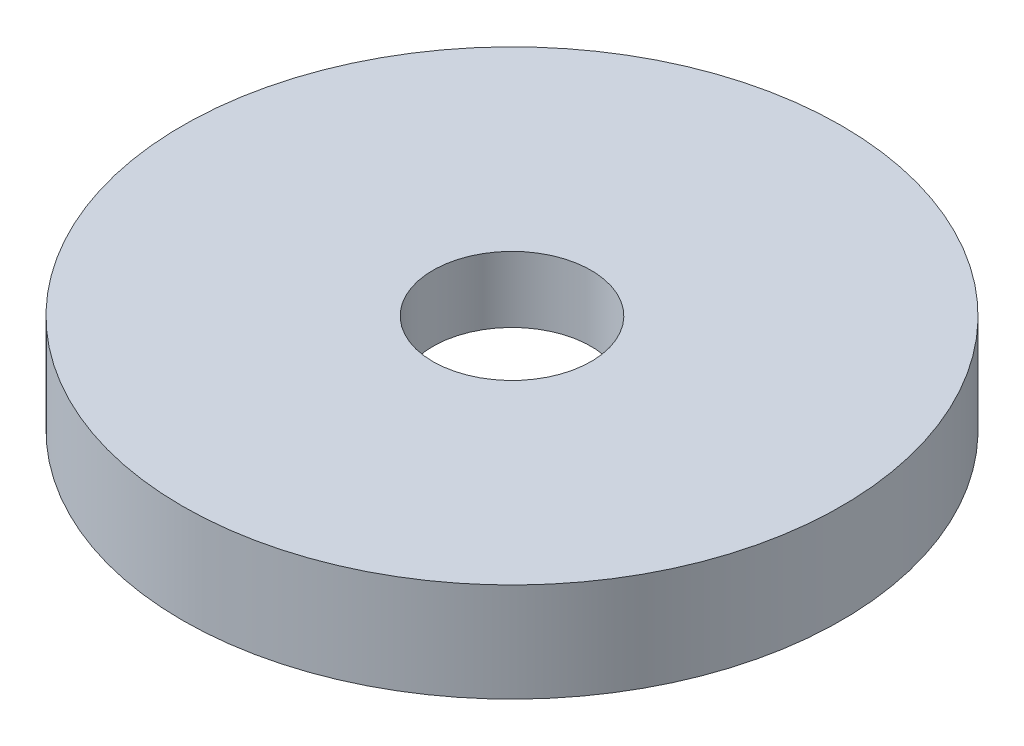
ISO-10303-21;
HEADER;
FILE_DESCRIPTION(('STEP AP214'),'2;1');
FILE_NAME('part.step','',(''),(''),'','','');
FILE_SCHEMA(('AUTOMOTIVE_DESIGN { 1 0 10303 214 1 1 1 1 }'));
ENDSEC;
DATA;
#1=APPLICATION_CONTEXT('core data for automotive mechanical design processes');
#2=APPLICATION_PROTOCOL_DEFINITION('international standard','automotive_design',2000,#1);
#3=PRODUCT_CONTEXT('',#1,'mechanical');
#4=PRODUCT('Part','Part','',(#3));
#5=PRODUCT_RELATED_PRODUCT_CATEGORY('part','',(#4));
#6=PRODUCT_DEFINITION_FORMATION('','',#4);
#7=PRODUCT_DEFINITION_CONTEXT('part definition',#1,'design');
#8=PRODUCT_DEFINITION('design','',#6,#7);
#9=PRODUCT_DEFINITION_SHAPE('','',#8);
#10=(LENGTH_UNIT() NAMED_UNIT(*) SI_UNIT(.MILLI.,.METRE.));
#11=(NAMED_UNIT(*) PLANE_ANGLE_UNIT() SI_UNIT($,.RADIAN.));
#12=(NAMED_UNIT(*) SI_UNIT($,.STERADIAN.) SOLID_ANGLE_UNIT());
#13=UNCERTAINTY_MEASURE_WITH_UNIT(LENGTH_MEASURE(1.E-05),#10,'distance_accuracy_value','');
#14=(GEOMETRIC_REPRESENTATION_CONTEXT(3) GLOBAL_UNCERTAINTY_ASSIGNED_CONTEXT((#13)) GLOBAL_UNIT_ASSIGNED_CONTEXT((#10,
#11,#12)) REPRESENTATION_CONTEXT('',''));
#15=CARTESIAN_POINT('',(0.,0.,0.));
#16=DIRECTION('',(0.,0.,1.));
#17=DIRECTION('',(1.,0.,0.));
#18=AXIS2_PLACEMENT_3D('',#15,#16,#17);
#19=CARTESIAN_POINT('',(0.,1.5,0.));
#20=DIRECTION('',(0.,-1.,0.));
#21=DIRECTION('',(0.,0.,-1.));
#22=AXIS2_PLACEMENT_3D('',#19,#20,#21);
#23=CYLINDRICAL_SURFACE('',#22,5.);
#24=CARTESIAN_POINT('',(0.,1.5,0.));
#25=DIRECTION('',(0.,1.,0.));
#26=DIRECTION('',(0.,0.,1.));
#27=AXIS2_PLACEMENT_3D('',#24,#25,#26);
#28=CIRCLE('',#27,5.);
#29=CARTESIAN_POINT('',(0.,1.5,5.));
#30=VERTEX_POINT('',#29);
#31=EDGE_CURVE('E43',#30,#30,#28,.T.);
#32=ORIENTED_EDGE('',*,*,#31,.F.);
#33=EDGE_LOOP('',(#32));
#34=FACE_BOUND('',#33,.T.);
#35=CARTESIAN_POINT('',(0.,0.,0.));
#36=DIRECTION('',(0.,1.,0.));
#37=DIRECTION('',(0.,0.,1.));
#38=AXIS2_PLACEMENT_3D('',#35,#36,#37);
#39=CIRCLE('',#38,5.);
#40=CARTESIAN_POINT('',(0.,0.,5.));
#41=VERTEX_POINT('',#40);
#42=EDGE_CURVE('E39',#41,#41,#39,.T.);
#43=ORIENTED_EDGE('',*,*,#42,.T.);
#44=EDGE_LOOP('',(#43));
#45=FACE_BOUND('',#44,.T.);
#46=ADVANCED_FACE('F36',(#34,#45),#23,.T.);
#47=CARTESIAN_POINT('',(0.,1.5,0.));
#48=DIRECTION('',(0.,-1.,0.));
#49=DIRECTION('',(0.,0.,-1.));
#50=AXIS2_PLACEMENT_3D('',#47,#48,#49);
#51=CYLINDRICAL_SURFACE('',#50,1.2);
#52=CARTESIAN_POINT('',(0.,0.5,0.));
#53=DIRECTION('',(0.,1.,0.));
#54=DIRECTION('',(0.,0.,1.));
#55=AXIS2_PLACEMENT_3D('',#52,#53,#54);
#56=CIRCLE('',#55,1.2);
#57=CARTESIAN_POINT('',(0.,0.5,1.2));
#58=VERTEX_POINT('',#57);
#59=EDGE_CURVE('E52',#58,#58,#56,.T.);
#60=ORIENTED_EDGE('',*,*,#59,.F.);
#61=EDGE_LOOP('',(#60));
#62=FACE_BOUND('',#61,.T.);
#63=CARTESIAN_POINT('',(0.,1.5,0.));
#64=DIRECTION('',(0.,1.,0.));
#65=DIRECTION('',(0.,0.,1.));
#66=AXIS2_PLACEMENT_3D('',#63,#64,#65);
#67=CIRCLE('',#66,1.2);
#68=CARTESIAN_POINT('',(0.,1.5,1.2));
#69=VERTEX_POINT('',#68);
#70=EDGE_CURVE('E10',#69,#69,#67,.T.);
#71=ORIENTED_EDGE('',*,*,#70,.T.);
#72=EDGE_LOOP('',(#71));
#73=FACE_BOUND('',#72,.T.);
#74=ADVANCED_FACE('F62',(#62,#73),#51,.F.);
#75=CARTESIAN_POINT('',(0.,1.5,0.));
#76=DIRECTION('',(0.,1.,0.));
#77=DIRECTION('',(0.,0.,1.));
#78=AXIS2_PLACEMENT_3D('',#75,#76,#77);
#79=PLANE('',#78);
#80=ORIENTED_EDGE('',*,*,#31,.T.);
#81=EDGE_LOOP('',(#80));
#82=FACE_BOUND('',#81,.T.);
#83=ORIENTED_EDGE('',*,*,#70,.F.);
#84=EDGE_LOOP('',(#83));
#85=FACE_BOUND('',#84,.T.);
#86=ADVANCED_FACE('F64',(#82,#85),#79,.T.);
#87=CARTESIAN_POINT('',(0.,0.,0.));
#88=DIRECTION('',(0.,1.,0.));
#89=DIRECTION('',(0.,0.,1.));
#90=AXIS2_PLACEMENT_3D('',#87,#88,#89);
#91=PLANE('',#90);
#92=CARTESIAN_POINT('',(0.,0.,0.));
#93=DIRECTION('',(0.,1.,0.));
#94=DIRECTION('',(0.,0.,1.));
#95=AXIS2_PLACEMENT_3D('',#92,#93,#94);
#96=CIRCLE('',#95,2.5);
#97=CARTESIAN_POINT('',(0.,0.,2.5));
#98=VERTEX_POINT('',#97);
#99=EDGE_CURVE('E49',#98,#98,#96,.T.);
#100=ORIENTED_EDGE('',*,*,#99,.T.);
#101=EDGE_LOOP('',(#100));
#102=FACE_BOUND('',#101,.T.);
#103=ORIENTED_EDGE('',*,*,#42,.F.);
#104=EDGE_LOOP('',(#103));
#105=FACE_BOUND('',#104,.T.);
#106=ADVANCED_FACE('F69',(#102,#105),#91,.F.);
#107=CARTESIAN_POINT('',(0.,0.5,0.));
#108=DIRECTION('',(0.,-1.,0.));
#109=DIRECTION('',(0.,0.,-1.));
#110=AXIS2_PLACEMENT_3D('',#107,#108,#109);
#111=CYLINDRICAL_SURFACE('',#110,2.5);
#112=CARTESIAN_POINT('',(0.,0.5,0.));
#113=DIRECTION('',(0.,1.,0.));
#114=DIRECTION('',(0.,0.,1.));
#115=AXIS2_PLACEMENT_3D('',#112,#113,#114);
#116=CIRCLE('',#115,2.5);
#117=CARTESIAN_POINT('',(0.,0.5,2.5));
#118=VERTEX_POINT('',#117);
#119=EDGE_CURVE('E53',#118,#118,#116,.T.);
#120=ORIENTED_EDGE('',*,*,#119,.T.);
#121=EDGE_LOOP('',(#120));
#122=FACE_BOUND('',#121,.T.);
#123=ORIENTED_EDGE('',*,*,#99,.F.);
#124=EDGE_LOOP('',(#123));
#125=FACE_BOUND('',#124,.T.);
#126=ADVANCED_FACE('F75',(#122,#125),#111,.F.);
#127=CARTESIAN_POINT('',(0.,0.5,0.));
#128=DIRECTION('',(0.,1.,0.));
#129=DIRECTION('',(0.,0.,1.));
#130=AXIS2_PLACEMENT_3D('',#127,#128,#129);
#131=PLANE('',#130);
#132=ORIENTED_EDGE('',*,*,#59,.T.);
#133=EDGE_LOOP('',(#132));
#134=FACE_BOUND('',#133,.T.);
#135=ORIENTED_EDGE('',*,*,#119,.F.);
#136=EDGE_LOOP('',(#135));
#137=FACE_BOUND('',#136,.T.);
#138=ADVANCED_FACE('F59',(#134,#137),#131,.F.);
#139=CLOSED_SHELL('',(#46,#74,#86,#106,#126,#138));
#140=MANIFOLD_SOLID_BREP('B2',#139);
#141=ADVANCED_BREP_SHAPE_REPRESENTATION('',(#18,#140),#14);
#142=SHAPE_DEFINITION_REPRESENTATION(#9,#141);
ENDSEC;
END-ISO-10303-21;
